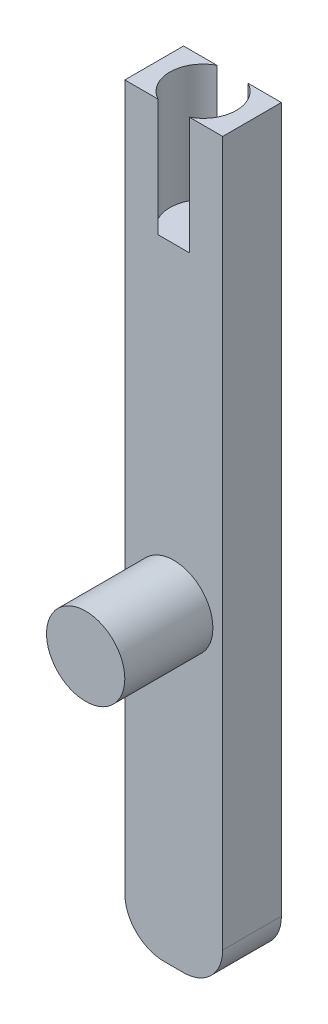
ISO-10303-21;
HEADER;
FILE_DESCRIPTION(('STEP AP214'),'2;1');
FILE_NAME('part.step','',(''),(''),'','','');
FILE_SCHEMA(('AUTOMOTIVE_DESIGN { 1 0 10303 214 1 1 1 1 }'));
ENDSEC;
DATA;
#1=APPLICATION_CONTEXT('core data for automotive mechanical design processes');
#2=APPLICATION_PROTOCOL_DEFINITION('international standard','automotive_design',2000,#1);
#3=PRODUCT_CONTEXT('',#1,'mechanical');
#4=PRODUCT('Part','Part','',(#3));
#5=PRODUCT_RELATED_PRODUCT_CATEGORY('part','',(#4));
#6=PRODUCT_DEFINITION_FORMATION('','',#4);
#7=PRODUCT_DEFINITION_CONTEXT('part definition',#1,'design');
#8=PRODUCT_DEFINITION('design','',#6,#7);
#9=PRODUCT_DEFINITION_SHAPE('','',#8);
#10=(LENGTH_UNIT() NAMED_UNIT(*) SI_UNIT(.MILLI.,.METRE.));
#11=(NAMED_UNIT(*) PLANE_ANGLE_UNIT() SI_UNIT($,.RADIAN.));
#12=(NAMED_UNIT(*) SI_UNIT($,.STERADIAN.) SOLID_ANGLE_UNIT());
#13=UNCERTAINTY_MEASURE_WITH_UNIT(LENGTH_MEASURE(1.E-05),#10,'distance_accuracy_value','');
#14=(GEOMETRIC_REPRESENTATION_CONTEXT(3) GLOBAL_UNCERTAINTY_ASSIGNED_CONTEXT((#13)) GLOBAL_UNIT_ASSIGNED_CONTEXT((#10,
#11,#12)) REPRESENTATION_CONTEXT('',''));
#15=CARTESIAN_POINT('',(0.,0.,0.));
#16=DIRECTION('',(0.,0.,1.));
#17=DIRECTION('',(1.,0.,0.));
#18=AXIS2_PLACEMENT_3D('',#15,#16,#17);
#19=CARTESIAN_POINT('',(0.,19.,1.5));
#20=DIRECTION('',(0.,-1.,0.));
#21=DIRECTION('',(0.,0.,-1.));
#22=AXIS2_PLACEMENT_3D('',#19,#20,#21);
#23=PLANE('',#22);
#24=DIRECTION('',(-1.,0.,0.));
#25=VECTOR('',#24,1.);
#26=CARTESIAN_POINT('',(0.,19.,0.));
#27=LINE('',#26,#25);
#28=CARTESIAN_POINT('',(0.,19.,0.));
#29=VERTEX_POINT('',#28);
#30=CARTESIAN_POINT('',(-0.85,19.,0.));
#31=VERTEX_POINT('',#30);
#32=EDGE_CURVE('E149',#29,#31,#27,.T.);
#33=ORIENTED_EDGE('',*,*,#32,.T.);
#34=CARTESIAN_POINT('',(-1.25,19.,0.75));
#35=DIRECTION('',(0.,1.,0.));
#36=DIRECTION('',(0.,0.,1.));
#37=AXIS2_PLACEMENT_3D('',#34,#35,#36);
#38=CIRCLE('',#37,0.85);
#39=CARTESIAN_POINT('',(-0.85,19.,1.5));
#40=VERTEX_POINT('',#39);
#41=EDGE_CURVE('E184',#40,#31,#38,.T.);
#42=ORIENTED_EDGE('',*,*,#41,.F.);
#43=DIRECTION('',(-1.,0.,0.));
#44=VECTOR('',#43,1.);
#45=CARTESIAN_POINT('',(0.,19.,1.5));
#46=LINE('',#45,#44);
#47=CARTESIAN_POINT('',(0.,19.,1.5));
#48=VERTEX_POINT('',#47);
#49=EDGE_CURVE('E133',#48,#40,#46,.T.);
#50=ORIENTED_EDGE('',*,*,#49,.F.);
#51=DIRECTION('',(0.,0.,-1.));
#52=VECTOR('',#51,1.);
#53=CARTESIAN_POINT('',(0.,19.,1.5));
#54=LINE('',#53,#52);
#55=EDGE_CURVE('E127',#48,#29,#54,.T.);
#56=ORIENTED_EDGE('',*,*,#55,.T.);
#57=EDGE_LOOP('',(#33,#42,#50,#56));
#58=FACE_BOUND('',#57,.T.);
#59=ADVANCED_FACE('F34',(#58),#23,.F.);
#60=CARTESIAN_POINT('',(-2.5,1.00000000000001,1.5));
#61=DIRECTION('',(1.,0.,0.));
#62=DIRECTION('',(0.,0.,-1.));
#63=AXIS2_PLACEMENT_3D('',#60,#61,#62);
#64=PLANE('',#63);
#65=DIRECTION('',(0.,-1.,0.));
#66=VECTOR('',#65,1.);
#67=CARTESIAN_POINT('',(-2.5,1.00000000000001,0.));
#68=LINE('',#67,#66);
#69=CARTESIAN_POINT('',(-2.5,19.,0.));
#70=VERTEX_POINT('',#69);
#71=CARTESIAN_POINT('',(-2.5,1.,0.));
#72=VERTEX_POINT('',#71);
#73=EDGE_CURVE('E138',#70,#72,#68,.T.);
#74=ORIENTED_EDGE('',*,*,#73,.T.);
#75=DIRECTION('',(0.,0.,-1.));
#76=VECTOR('',#75,1.);
#77=CARTESIAN_POINT('',(-2.5,1.,1.5));
#78=LINE('',#77,#76);
#79=CARTESIAN_POINT('',(-2.5,1.,1.5));
#80=VERTEX_POINT('',#79);
#81=EDGE_CURVE('E159',#80,#72,#78,.T.);
#82=ORIENTED_EDGE('',*,*,#81,.F.);
#83=DIRECTION('',(0.,-1.,0.));
#84=VECTOR('',#83,1.);
#85=CARTESIAN_POINT('',(-2.5,1.00000000000001,1.5));
#86=LINE('',#85,#84);
#87=CARTESIAN_POINT('',(-2.5,19.,1.5));
#88=VERTEX_POINT('',#87);
#89=EDGE_CURVE('E152',#88,#80,#86,.T.);
#90=ORIENTED_EDGE('',*,*,#89,.F.);
#91=DIRECTION('',(0.,0.,-1.));
#92=VECTOR('',#91,1.);
#93=CARTESIAN_POINT('',(-2.5,19.,1.5));
#94=LINE('',#93,#92);
#95=EDGE_CURVE('E137',#88,#70,#94,.T.);
#96=ORIENTED_EDGE('',*,*,#95,.T.);
#97=EDGE_LOOP('',(#74,#82,#90,#96));
#98=FACE_BOUND('',#97,.T.);
#99=ADVANCED_FACE('F36',(#98),#64,.F.);
#100=CARTESIAN_POINT('',(-1.5,1.,1.5));
#101=DIRECTION('',(0.,0.,-1.));
#102=DIRECTION('',(-1.,0.,0.));
#103=AXIS2_PLACEMENT_3D('',#100,#101,#102);
#104=CYLINDRICAL_SURFACE('',#103,1.);
#105=CARTESIAN_POINT('',(-1.5,1.,0.));
#106=DIRECTION('',(0.,0.,1.));
#107=DIRECTION('',(-1.,0.,0.));
#108=AXIS2_PLACEMENT_3D('',#105,#106,#107);
#109=CIRCLE('',#108,1.);
#110=CARTESIAN_POINT('',(-1.49999999999999,0.,0.));
#111=VERTEX_POINT('',#110);
#112=EDGE_CURVE('E141',#72,#111,#109,.T.);
#113=ORIENTED_EDGE('',*,*,#112,.T.);
#114=DIRECTION('',(0.,0.,-1.));
#115=VECTOR('',#114,1.);
#116=CARTESIAN_POINT('',(-1.49999999999999,0.,1.5));
#117=LINE('',#116,#115);
#118=CARTESIAN_POINT('',(-1.49999999999999,0.,1.5));
#119=VERTEX_POINT('',#118);
#120=EDGE_CURVE('E156',#119,#111,#117,.T.);
#121=ORIENTED_EDGE('',*,*,#120,.F.);
#122=CARTESIAN_POINT('',(-1.5,1.,1.5));
#123=DIRECTION('',(0.,0.,1.));
#124=DIRECTION('',(-1.,0.,0.));
#125=AXIS2_PLACEMENT_3D('',#122,#123,#124);
#126=CIRCLE('',#125,1.);
#127=EDGE_CURVE('E95',#80,#119,#126,.T.);
#128=ORIENTED_EDGE('',*,*,#127,.F.);
#129=ORIENTED_EDGE('',*,*,#81,.T.);
#130=EDGE_LOOP('',(#113,#121,#128,#129));
#131=FACE_BOUND('',#130,.T.);
#132=ADVANCED_FACE('F204',(#131),#104,.T.);
#133=CARTESIAN_POINT('',(-1.00000000000001,0.,1.5));
#134=DIRECTION('',(0.,1.,0.));
#135=DIRECTION('',(-1.,0.,0.));
#136=AXIS2_PLACEMENT_3D('',#133,#134,#135);
#137=PLANE('',#136);
#138=DIRECTION('',(1.,0.,0.));
#139=VECTOR('',#138,1.);
#140=CARTESIAN_POINT('',(-1.00000000000001,0.,0.));
#141=LINE('',#140,#139);
#142=CARTESIAN_POINT('',(-1.00000000000001,0.,0.));
#143=VERTEX_POINT('',#142);
#144=EDGE_CURVE('E144',#111,#143,#141,.T.);
#145=ORIENTED_EDGE('',*,*,#144,.T.);
#146=DIRECTION('',(0.,0.,-1.));
#147=VECTOR('',#146,1.);
#148=CARTESIAN_POINT('',(-1.00000000000001,0.,1.5));
#149=LINE('',#148,#147);
#150=CARTESIAN_POINT('',(-1.00000000000001,0.,1.5));
#151=VERTEX_POINT('',#150);
#152=EDGE_CURVE('E126',#151,#143,#149,.T.);
#153=ORIENTED_EDGE('',*,*,#152,.F.);
#154=DIRECTION('',(1.,0.,0.));
#155=VECTOR('',#154,1.);
#156=CARTESIAN_POINT('',(-1.00000000000001,0.,1.5));
#157=LINE('',#156,#155);
#158=EDGE_CURVE('E114',#119,#151,#157,.T.);
#159=ORIENTED_EDGE('',*,*,#158,.F.);
#160=ORIENTED_EDGE('',*,*,#120,.T.);
#161=EDGE_LOOP('',(#145,#153,#159,#160));
#162=FACE_BOUND('',#161,.T.);
#163=ADVANCED_FACE('F207',(#162),#137,.F.);
#164=CARTESIAN_POINT('',(-1.,1.,1.5));
#165=DIRECTION('',(0.,0.,-1.));
#166=DIRECTION('',(-1.,0.,0.));
#167=AXIS2_PLACEMENT_3D('',#164,#165,#166);
#168=CYLINDRICAL_SURFACE('',#167,1.);
#169=CARTESIAN_POINT('',(-1.,1.,0.));
#170=DIRECTION('',(0.,0.,1.));
#171=DIRECTION('',(1.,0.,0.));
#172=AXIS2_PLACEMENT_3D('',#169,#170,#171);
#173=CIRCLE('',#172,1.);
#174=CARTESIAN_POINT('',(0.,1.00000000000001,0.));
#175=VERTEX_POINT('',#174);
#176=EDGE_CURVE('E123',#143,#175,#173,.T.);
#177=ORIENTED_EDGE('',*,*,#176,.T.);
#178=DIRECTION('',(0.,0.,-1.));
#179=VECTOR('',#178,1.);
#180=CARTESIAN_POINT('',(0.,1.00000000000001,1.5));
#181=LINE('',#180,#179);
#182=CARTESIAN_POINT('',(0.,1.00000000000001,1.5));
#183=VERTEX_POINT('',#182);
#184=EDGE_CURVE('E120',#183,#175,#181,.T.);
#185=ORIENTED_EDGE('',*,*,#184,.F.);
#186=CARTESIAN_POINT('',(-1.,1.,1.5));
#187=DIRECTION('',(0.,0.,1.));
#188=DIRECTION('',(1.,0.,0.));
#189=AXIS2_PLACEMENT_3D('',#186,#187,#188);
#190=CIRCLE('',#189,1.);
#191=EDGE_CURVE('E104',#151,#183,#190,.T.);
#192=ORIENTED_EDGE('',*,*,#191,.F.);
#193=ORIENTED_EDGE('',*,*,#152,.T.);
#194=EDGE_LOOP('',(#177,#185,#192,#193));
#195=FACE_BOUND('',#194,.T.);
#196=ADVANCED_FACE('F121',(#195),#168,.T.);
#197=CARTESIAN_POINT('',(0.,1.00000000000001,1.5));
#198=DIRECTION('',(-1.,0.,0.));
#199=DIRECTION('',(0.,0.,1.));
#200=AXIS2_PLACEMENT_3D('',#197,#198,#199);
#201=PLANE('',#200);
#202=DIRECTION('',(0.,1.,0.));
#203=VECTOR('',#202,1.);
#204=CARTESIAN_POINT('',(0.,1.00000000000001,0.));
#205=LINE('',#204,#203);
#206=EDGE_CURVE('E147',#175,#29,#205,.T.);
#207=ORIENTED_EDGE('',*,*,#206,.T.);
#208=ORIENTED_EDGE('',*,*,#55,.F.);
#209=DIRECTION('',(0.,1.,0.));
#210=VECTOR('',#209,1.);
#211=CARTESIAN_POINT('',(0.,1.00000000000001,1.5));
#212=LINE('',#211,#210);
#213=EDGE_CURVE('E111',#183,#48,#212,.T.);
#214=ORIENTED_EDGE('',*,*,#213,.F.);
#215=ORIENTED_EDGE('',*,*,#184,.T.);
#216=EDGE_LOOP('',(#207,#208,#214,#215));
#217=FACE_BOUND('',#216,.T.);
#218=ADVANCED_FACE('F129',(#217),#201,.F.);
#219=CARTESIAN_POINT('',(-1.65,19.,1.5));
#220=VERTEX_POINT('',#219);
#221=EDGE_CURVE('E58',#220,#88,#46,.T.);
#222=ORIENTED_EDGE('',*,*,#221,.F.);
#223=CARTESIAN_POINT('',(-1.65,19.,0.));
#224=VERTEX_POINT('',#223);
#225=EDGE_CURVE('E178',#224,#220,#38,.T.);
#226=ORIENTED_EDGE('',*,*,#225,.F.);
#227=EDGE_CURVE('E86',#224,#70,#27,.T.);
#228=ORIENTED_EDGE('',*,*,#227,.T.);
#229=ORIENTED_EDGE('',*,*,#95,.F.);
#230=EDGE_LOOP('',(#222,#226,#228,#229));
#231=FACE_BOUND('',#230,.T.);
#232=ADVANCED_FACE('F183',(#231),#23,.F.);
#233=CARTESIAN_POINT('',(-1.,1.,1.5));
#234=DIRECTION('',(0.,0.,1.));
#235=DIRECTION('',(1.,0.,0.));
#236=AXIS2_PLACEMENT_3D('',#233,#234,#235);
#237=PLANE('',#236);
#238=DIRECTION('',(0.,1.,0.));
#239=VECTOR('',#238,1.);
#240=CARTESIAN_POINT('',(-0.85,16.,1.5));
#241=LINE('',#240,#239);
#242=CARTESIAN_POINT('',(-0.85,16.,1.5));
#243=VERTEX_POINT('',#242);
#244=EDGE_CURVE('E194',#243,#40,#241,.T.);
#245=ORIENTED_EDGE('',*,*,#244,.F.);
#246=DIRECTION('',(-1.,0.,0.));
#247=VECTOR('',#246,1.);
#248=CARTESIAN_POINT('',(-1.,16.,1.5));
#249=LINE('',#248,#247);
#250=CARTESIAN_POINT('',(-1.65,16.,1.5));
#251=VERTEX_POINT('',#250);
#252=EDGE_CURVE('E189',#243,#251,#249,.T.);
#253=ORIENTED_EDGE('',*,*,#252,.T.);
#254=DIRECTION('',(0.,1.,0.));
#255=VECTOR('',#254,1.);
#256=CARTESIAN_POINT('',(-1.65,16.,1.5));
#257=LINE('',#256,#255);
#258=EDGE_CURVE('E192',#220,#251,#257,.F.);
#259=ORIENTED_EDGE('',*,*,#258,.F.);
#260=ORIENTED_EDGE('',*,*,#221,.T.);
#261=ORIENTED_EDGE('',*,*,#89,.T.);
#262=ORIENTED_EDGE('',*,*,#127,.T.);
#263=ORIENTED_EDGE('',*,*,#158,.T.);
#264=ORIENTED_EDGE('',*,*,#191,.T.);
#265=ORIENTED_EDGE('',*,*,#213,.T.);
#266=ORIENTED_EDGE('',*,*,#49,.T.);
#267=EDGE_LOOP('',(#245,#253,#259,#260,#261,#262,#263,#264,#265,#266));
#268=FACE_BOUND('',#267,.T.);
#269=CARTESIAN_POINT('',(-1.25,8.,1.5));
#270=DIRECTION('',(0.,0.,1.));
#271=DIRECTION('',(1.,0.,0.));
#272=AXIS2_PLACEMENT_3D('',#269,#270,#271);
#273=CIRCLE('',#272,1.);
#274=CARTESIAN_POINT('',(-0.249999999999998,8.,1.5));
#275=VERTEX_POINT('',#274);
#276=EDGE_CURVE('E161',#275,#275,#273,.T.);
#277=ORIENTED_EDGE('',*,*,#276,.F.);
#278=EDGE_LOOP('',(#277));
#279=FACE_BOUND('',#278,.T.);
#280=ADVANCED_FACE('F107',(#268,#279),#237,.T.);
#281=CARTESIAN_POINT('',(-1.,1.,0.));
#282=DIRECTION('',(0.,0.,1.));
#283=DIRECTION('',(1.,0.,0.));
#284=AXIS2_PLACEMENT_3D('',#281,#282,#283);
#285=PLANE('',#284);
#286=DIRECTION('',(-1.,0.,0.));
#287=VECTOR('',#286,1.);
#288=CARTESIAN_POINT('',(-1.,16.,0.));
#289=LINE('',#288,#287);
#290=CARTESIAN_POINT('',(-0.85,16.,0.));
#291=VERTEX_POINT('',#290);
#292=CARTESIAN_POINT('',(-1.65,16.,0.));
#293=VERTEX_POINT('',#292);
#294=EDGE_CURVE('E162',#291,#293,#289,.T.);
#295=ORIENTED_EDGE('',*,*,#294,.F.);
#296=DIRECTION('',(0.,1.,0.));
#297=VECTOR('',#296,1.);
#298=CARTESIAN_POINT('',(-0.85,16.,0.));
#299=LINE('',#298,#297);
#300=EDGE_CURVE('E11',#291,#31,#299,.T.);
#301=ORIENTED_EDGE('',*,*,#300,.T.);
#302=ORIENTED_EDGE('',*,*,#32,.F.);
#303=ORIENTED_EDGE('',*,*,#206,.F.);
#304=ORIENTED_EDGE('',*,*,#176,.F.);
#305=ORIENTED_EDGE('',*,*,#144,.F.);
#306=ORIENTED_EDGE('',*,*,#112,.F.);
#307=ORIENTED_EDGE('',*,*,#73,.F.);
#308=ORIENTED_EDGE('',*,*,#227,.F.);
#309=DIRECTION('',(0.,1.,0.));
#310=VECTOR('',#309,1.);
#311=CARTESIAN_POINT('',(-1.65,16.,0.));
#312=LINE('',#311,#310);
#313=EDGE_CURVE('E42',#224,#293,#312,.F.);
#314=ORIENTED_EDGE('',*,*,#313,.T.);
#315=EDGE_LOOP('',(#295,#301,#302,#303,#304,#305,#306,#307,#308,#314));
#316=FACE_BOUND('',#315,.T.);
#317=ADVANCED_FACE('F168',(#316),#285,.F.);
#318=CARTESIAN_POINT('',(-1.25,8.,3.75));
#319=DIRECTION('',(0.,0.,-1.));
#320=DIRECTION('',(-1.,0.,0.));
#321=AXIS2_PLACEMENT_3D('',#318,#319,#320);
#322=CYLINDRICAL_SURFACE('',#321,1.);
#323=CARTESIAN_POINT('',(-1.25,8.,3.75));
#324=DIRECTION('',(0.,0.,1.));
#325=DIRECTION('',(1.,0.,0.));
#326=AXIS2_PLACEMENT_3D('',#323,#324,#325);
#327=CIRCLE('',#326,1.);
#328=CARTESIAN_POINT('',(-0.249999999999998,8.,3.75));
#329=VERTEX_POINT('',#328);
#330=EDGE_CURVE('E142',#329,#329,#327,.T.);
#331=ORIENTED_EDGE('',*,*,#330,.F.);
#332=EDGE_LOOP('',(#331));
#333=FACE_BOUND('',#332,.T.);
#334=ORIENTED_EDGE('',*,*,#276,.T.);
#335=EDGE_LOOP('',(#334));
#336=FACE_BOUND('',#335,.T.);
#337=ADVANCED_FACE('F226',(#333,#336),#322,.T.);
#338=CARTESIAN_POINT('',(-1.25,8.,3.75));
#339=DIRECTION('',(0.,0.,1.));
#340=DIRECTION('',(1.,0.,0.));
#341=AXIS2_PLACEMENT_3D('',#338,#339,#340);
#342=PLANE('',#341);
#343=ORIENTED_EDGE('',*,*,#330,.T.);
#344=EDGE_LOOP('',(#343));
#345=FACE_BOUND('',#344,.T.);
#346=ADVANCED_FACE('F220',(#345),#342,.T.);
#347=CARTESIAN_POINT('',(-1.25,16.,0.75));
#348=DIRECTION('',(0.,1.,0.));
#349=DIRECTION('',(0.,0.,1.));
#350=AXIS2_PLACEMENT_3D('',#347,#348,#349);
#351=CYLINDRICAL_SURFACE('',#350,0.85);
#352=ORIENTED_EDGE('',*,*,#244,.T.);
#353=ORIENTED_EDGE('',*,*,#41,.T.);
#354=ORIENTED_EDGE('',*,*,#300,.F.);
#355=CARTESIAN_POINT('',(-1.25,16.,0.75));
#356=DIRECTION('',(0.,1.,0.));
#357=DIRECTION('',(0.,0.,1.));
#358=AXIS2_PLACEMENT_3D('',#355,#356,#357);
#359=CIRCLE('',#358,0.85);
#360=EDGE_CURVE('E49',#243,#291,#359,.T.);
#361=ORIENTED_EDGE('',*,*,#360,.F.);
#362=EDGE_LOOP('',(#352,#353,#354,#361));
#363=FACE_BOUND('',#362,.T.);
#364=ADVANCED_FACE('F218',(#363),#351,.F.);
#365=ORIENTED_EDGE('',*,*,#258,.T.);
#366=EDGE_CURVE('E180',#293,#251,#359,.T.);
#367=ORIENTED_EDGE('',*,*,#366,.F.);
#368=ORIENTED_EDGE('',*,*,#313,.F.);
#369=ORIENTED_EDGE('',*,*,#225,.T.);
#370=EDGE_LOOP('',(#365,#367,#368,#369));
#371=FACE_BOUND('',#370,.T.);
#372=ADVANCED_FACE('F176',(#371),#351,.F.);
#373=CARTESIAN_POINT('',(-1.25,16.,0.75));
#374=DIRECTION('',(0.,1.,0.));
#375=DIRECTION('',(0.,0.,1.));
#376=AXIS2_PLACEMENT_3D('',#373,#374,#375);
#377=PLANE('',#376);
#378=ORIENTED_EDGE('',*,*,#360,.T.);
#379=ORIENTED_EDGE('',*,*,#294,.T.);
#380=ORIENTED_EDGE('',*,*,#366,.T.);
#381=ORIENTED_EDGE('',*,*,#252,.F.);
#382=EDGE_LOOP('',(#378,#379,#380,#381));
#383=FACE_BOUND('',#382,.T.);
#384=ADVANCED_FACE('F217',(#383),#377,.T.);
#385=CLOSED_SHELL('',(#59,#99,#132,#163,#196,#218,#232,#280,#317,#337,#346,#364,#372,#384));
#386=MANIFOLD_SOLID_BREP('B2',#385);
#387=ADVANCED_BREP_SHAPE_REPRESENTATION('',(#18,#386),#14);
#388=SHAPE_DEFINITION_REPRESENTATION(#9,#387);
ENDSEC;
END-ISO-10303-21;
